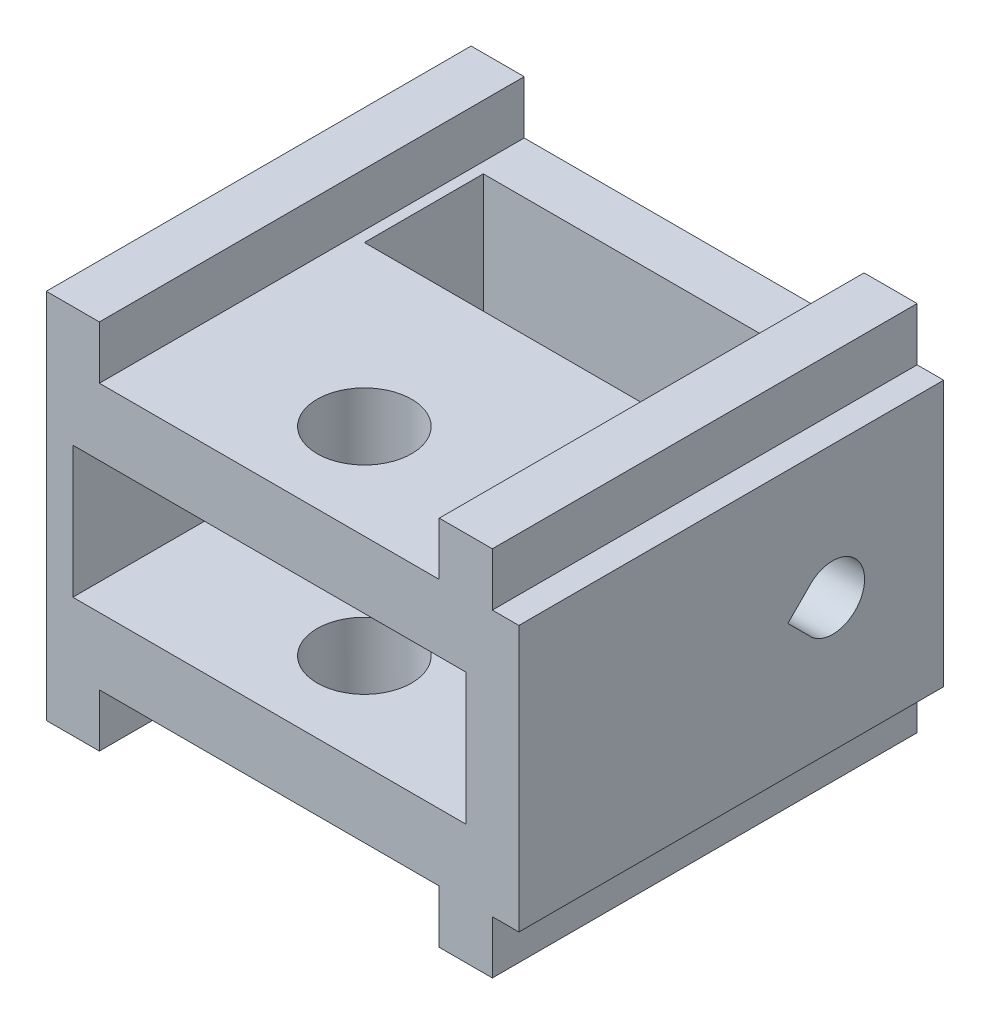
ISO-10303-21;
HEADER;
FILE_DESCRIPTION(('STEP AP214'),'2;1');
FILE_NAME('part.step','',(''),(''),'','','');
FILE_SCHEMA(('AUTOMOTIVE_DESIGN { 1 0 10303 214 1 1 1 1 }'));
ENDSEC;
DATA;
#1=APPLICATION_CONTEXT('core data for automotive mechanical design processes');
#2=APPLICATION_PROTOCOL_DEFINITION('international standard','automotive_design',2000,#1);
#3=PRODUCT_CONTEXT('',#1,'mechanical');
#4=PRODUCT('Part','Part','',(#3));
#5=PRODUCT_RELATED_PRODUCT_CATEGORY('part','',(#4));
#6=PRODUCT_DEFINITION_FORMATION('','',#4);
#7=PRODUCT_DEFINITION_CONTEXT('part definition',#1,'design');
#8=PRODUCT_DEFINITION('design','',#6,#7);
#9=PRODUCT_DEFINITION_SHAPE('','',#8);
#10=(LENGTH_UNIT() NAMED_UNIT(*) SI_UNIT(.MILLI.,.METRE.));
#11=(NAMED_UNIT(*) PLANE_ANGLE_UNIT() SI_UNIT($,.RADIAN.));
#12=(NAMED_UNIT(*) SI_UNIT($,.STERADIAN.) SOLID_ANGLE_UNIT());
#13=UNCERTAINTY_MEASURE_WITH_UNIT(LENGTH_MEASURE(1.E-05),#10,'distance_accuracy_value','');
#14=(GEOMETRIC_REPRESENTATION_CONTEXT(3) GLOBAL_UNCERTAINTY_ASSIGNED_CONTEXT((#13)) GLOBAL_UNIT_ASSIGNED_CONTEXT((#10,
#11,#12)) REPRESENTATION_CONTEXT('',''));
#15=CARTESIAN_POINT('',(0.,0.,0.));
#16=DIRECTION('',(0.,0.,1.));
#17=DIRECTION('',(1.,0.,0.));
#18=AXIS2_PLACEMENT_3D('',#15,#16,#17);
#19=CARTESIAN_POINT('',(19.5257731958763,25.,0.721649484536076));
#20=DIRECTION('',(-1.,0.,0.));
#21=DIRECTION('',(0.,0.,1.));
#22=AXIS2_PLACEMENT_3D('',#19,#20,#21);
#23=PLANE('',#22);
#24=DIRECTION('',(0.,0.,-1.));
#25=VECTOR('',#24,1.);
#26=CARTESIAN_POINT('',(19.5257731958763,0.,0.72164948453609));
#27=LINE('',#26,#25);
#28=CARTESIAN_POINT('',(19.5257731958763,0.,40.7216494845361));
#29=VERTEX_POINT('',#28);
#30=CARTESIAN_POINT('',(19.5257731958763,0.,0.721649484536076));
#31=VERTEX_POINT('',#30);
#32=EDGE_CURVE('E335',#29,#31,#27,.T.);
#33=ORIENTED_EDGE('',*,*,#32,.F.);
#34=DIRECTION('',(0.,-1.,0.));
#35=VECTOR('',#34,1.);
#36=CARTESIAN_POINT('',(19.5257731958763,25.,40.7216494845361));
#37=LINE('',#36,#35);
#38=CARTESIAN_POINT('',(19.5257731958763,-5.,40.7216494845361));
#39=VERTEX_POINT('',#38);
#40=EDGE_CURVE('E595',#29,#39,#37,.T.);
#41=ORIENTED_EDGE('',*,*,#40,.T.);
#42=DIRECTION('',(0.,0.,1.));
#43=VECTOR('',#42,1.);
#44=CARTESIAN_POINT('',(19.5257731958763,-5.,0.721649484536076));
#45=LINE('',#44,#43);
#46=CARTESIAN_POINT('',(19.5257731958763,-5.,0.721649484536076));
#47=VERTEX_POINT('',#46);
#48=EDGE_CURVE('E413',#47,#39,#45,.T.);
#49=ORIENTED_EDGE('',*,*,#48,.F.);
#50=DIRECTION('',(0.,-1.,0.));
#51=VECTOR('',#50,1.);
#52=CARTESIAN_POINT('',(19.5257731958763,25.,0.721649484536076));
#53=LINE('',#52,#51);
#54=EDGE_CURVE('E61',#31,#47,#53,.T.);
#55=ORIENTED_EDGE('',*,*,#54,.F.);
#56=EDGE_LOOP('',(#33,#41,#49,#55));
#57=FACE_BOUND('',#56,.T.);
#58=ADVANCED_FACE('F53',(#57),#23,.F.);
#59=DIRECTION('',(0.,0.,1.));
#60=VECTOR('',#59,1.);
#61=CARTESIAN_POINT('',(19.5257731958763,25.,0.72164948453609));
#62=LINE('',#61,#60);
#63=CARTESIAN_POINT('',(19.5257731958763,25.,0.721649484536076));
#64=VERTEX_POINT('',#63);
#65=CARTESIAN_POINT('',(19.5257731958763,25.,40.7216494845361));
#66=VERTEX_POINT('',#65);
#67=EDGE_CURVE('E329',#64,#66,#62,.T.);
#68=ORIENTED_EDGE('',*,*,#67,.F.);
#69=CARTESIAN_POINT('',(19.5257731958763,30.,0.72164948453607));
#70=VERTEX_POINT('',#69);
#71=EDGE_CURVE('E12',#70,#64,#53,.T.);
#72=ORIENTED_EDGE('',*,*,#71,.F.);
#73=DIRECTION('',(0.,0.,-1.));
#74=VECTOR('',#73,1.);
#75=CARTESIAN_POINT('',(19.5257731958763,30.,0.72164948453607));
#76=LINE('',#75,#74);
#77=CARTESIAN_POINT('',(19.5257731958763,30.,40.7216494845361));
#78=VERTEX_POINT('',#77);
#79=EDGE_CURVE('E463',#78,#70,#76,.T.);
#80=ORIENTED_EDGE('',*,*,#79,.F.);
#81=EDGE_CURVE('E602',#78,#66,#37,.T.);
#82=ORIENTED_EDGE('',*,*,#81,.T.);
#83=EDGE_LOOP('',(#68,#72,#80,#82));
#84=FACE_BOUND('',#83,.T.);
#85=ADVANCED_FACE('F760',(#84),#23,.F.);
#86=CARTESIAN_POINT('',(0.,0.,0.));
#87=DIRECTION('',(0.,-1.,0.));
#88=DIRECTION('',(0.,0.,-1.));
#89=AXIS2_PLACEMENT_3D('',#86,#87,#88);
#90=PLANE('',#89);
#91=DIRECTION('',(0.,0.,1.));
#92=VECTOR('',#91,1.);
#93=CARTESIAN_POINT('',(-17.4742268041237,0.,0.));
#94=LINE('',#93,#92);
#95=CARTESIAN_POINT('',(-17.4742268041237,0.,0.721649484536076));
#96=VERTEX_POINT('',#95);
#97=CARTESIAN_POINT('',(-17.4742268041237,0.,40.7216494845361));
#98=VERTEX_POINT('',#97);
#99=EDGE_CURVE('E372',#96,#98,#94,.T.);
#100=ORIENTED_EDGE('',*,*,#99,.F.);
#101=DIRECTION('',(-1.,0.,0.));
#102=VECTOR('',#101,1.);
#103=CARTESIAN_POINT('',(19.5257731958763,0.,0.721649484536076));
#104=LINE('',#103,#102);
#105=CARTESIAN_POINT('',(14.5257731958763,0.,0.721649484536062));
#106=VERTEX_POINT('',#105);
#107=EDGE_CURVE('E568',#106,#96,#104,.T.);
#108=ORIENTED_EDGE('',*,*,#107,.F.);
#109=DIRECTION('',(0.,0.,1.));
#110=VECTOR('',#109,1.);
#111=CARTESIAN_POINT('',(14.5257731958763,0.,0.721649484536062));
#112=LINE('',#111,#110);
#113=CARTESIAN_POINT('',(14.5257731958763,0.,40.7216494845361));
#114=VERTEX_POINT('',#113);
#115=EDGE_CURVE('E387',#106,#114,#112,.T.);
#116=ORIENTED_EDGE('',*,*,#115,.T.);
#117=DIRECTION('',(1.,0.,0.));
#118=VECTOR('',#117,1.);
#119=CARTESIAN_POINT('',(19.5257731958763,0.,40.7216494845361));
#120=LINE('',#119,#118);
#121=EDGE_CURVE('E592',#98,#114,#120,.T.);
#122=ORIENTED_EDGE('',*,*,#121,.F.);
#123=EDGE_LOOP('',(#100,#108,#116,#122));
#124=FACE_BOUND('',#123,.T.);
#125=DIRECTION('',(0.,0.,-1.));
#126=VECTOR('',#125,1.);
#127=CARTESIAN_POINT('',(13.5257731958763,0.,16.7716494845361));
#128=LINE('',#127,#126);
#129=CARTESIAN_POINT('',(13.5257731958763,0.,16.7716494845361));
#130=VERTEX_POINT('',#129);
#131=CARTESIAN_POINT('',(13.5257731958763,0.,5.57164948453608));
#132=VERTEX_POINT('',#131);
#133=EDGE_CURVE('E531',#130,#132,#128,.T.);
#134=ORIENTED_EDGE('',*,*,#133,.T.);
#135=DIRECTION('',(-1.,0.,0.));
#136=VECTOR('',#135,1.);
#137=CARTESIAN_POINT('',(13.5257731958763,0.,5.57164948453608));
#138=LINE('',#137,#136);
#139=CARTESIAN_POINT('',(-16.4742268041237,0.,5.57164948453608));
#140=VERTEX_POINT('',#139);
#141=EDGE_CURVE('E535',#132,#140,#138,.T.);
#142=ORIENTED_EDGE('',*,*,#141,.T.);
#143=DIRECTION('',(0.,0.,1.));
#144=VECTOR('',#143,1.);
#145=CARTESIAN_POINT('',(-16.4742268041237,0.,16.7716494845361));
#146=LINE('',#145,#144);
#147=CARTESIAN_POINT('',(-16.4742268041237,0.,16.7716494845361));
#148=VERTEX_POINT('',#147);
#149=EDGE_CURVE('E540',#140,#148,#146,.T.);
#150=ORIENTED_EDGE('',*,*,#149,.T.);
#151=DIRECTION('',(1.,0.,0.));
#152=VECTOR('',#151,1.);
#153=CARTESIAN_POINT('',(13.5257731958763,0.,16.7716494845361));
#154=LINE('',#153,#152);
#155=EDGE_CURVE('E544',#148,#130,#154,.T.);
#156=ORIENTED_EDGE('',*,*,#155,.T.);
#157=EDGE_LOOP('',(#134,#142,#150,#156));
#158=FACE_BOUND('',#157,.T.);
#159=CARTESIAN_POINT('',(-1.47422680412371,0.,31.7716494845361));
#160=DIRECTION('',(0.,1.,0.));
#161=DIRECTION('',(0.,0.,1.));
#162=AXIS2_PLACEMENT_3D('',#159,#160,#161);
#163=CIRCLE('',#162,4.45);
#164=CARTESIAN_POINT('',(-1.47422680412371,0.,36.2216494845361));
#165=VERTEX_POINT('',#164);
#166=EDGE_CURVE('E553',#165,#165,#163,.T.);
#167=ORIENTED_EDGE('',*,*,#166,.T.);
#168=EDGE_LOOP('',(#167));
#169=FACE_BOUND('',#168,.T.);
#170=ADVANCED_FACE('F710',(#124,#158,#169),#90,.T.);
#171=CARTESIAN_POINT('',(0.,25.,0.));
#172=DIRECTION('',(0.,-1.,0.));
#173=DIRECTION('',(0.,0.,-1.));
#174=AXIS2_PLACEMENT_3D('',#171,#172,#173);
#175=PLANE('',#174);
#176=DIRECTION('',(-1.,0.,0.));
#177=VECTOR('',#176,1.);
#178=CARTESIAN_POINT('',(13.5257731958763,25.,5.57164948453608));
#179=LINE('',#178,#177);
#180=CARTESIAN_POINT('',(13.5257731958763,25.,5.57164948453608));
#181=VERTEX_POINT('',#180);
#182=CARTESIAN_POINT('',(-16.4742268041237,25.,5.57164948453608));
#183=VERTEX_POINT('',#182);
#184=EDGE_CURVE('E552',#181,#183,#179,.T.);
#185=ORIENTED_EDGE('',*,*,#184,.F.);
#186=DIRECTION('',(0.,0.,-1.));
#187=VECTOR('',#186,1.);
#188=CARTESIAN_POINT('',(13.5257731958763,25.,16.7716494845361));
#189=LINE('',#188,#187);
#190=CARTESIAN_POINT('',(13.5257731958763,25.,16.7716494845361));
#191=VERTEX_POINT('',#190);
#192=EDGE_CURVE('E549',#191,#181,#189,.T.);
#193=ORIENTED_EDGE('',*,*,#192,.F.);
#194=DIRECTION('',(1.,0.,0.));
#195=VECTOR('',#194,1.);
#196=CARTESIAN_POINT('',(13.5257731958763,25.,16.7716494845361));
#197=LINE('',#196,#195);
#198=CARTESIAN_POINT('',(-16.4742268041237,25.,16.7716494845361));
#199=VERTEX_POINT('',#198);
#200=EDGE_CURVE('E536',#199,#191,#197,.T.);
#201=ORIENTED_EDGE('',*,*,#200,.F.);
#202=DIRECTION('',(0.,0.,1.));
#203=VECTOR('',#202,1.);
#204=CARTESIAN_POINT('',(-16.4742268041237,25.,16.7716494845361));
#205=LINE('',#204,#203);
#206=EDGE_CURVE('E557',#183,#199,#205,.T.);
#207=ORIENTED_EDGE('',*,*,#206,.F.);
#208=EDGE_LOOP('',(#185,#193,#201,#207));
#209=FACE_BOUND('',#208,.T.);
#210=CARTESIAN_POINT('',(-1.47422680412371,25.,31.7716494845361));
#211=DIRECTION('',(0.,1.,0.));
#212=DIRECTION('',(0.,0.,1.));
#213=AXIS2_PLACEMENT_3D('',#210,#211,#212);
#214=CIRCLE('',#213,4.45);
#215=CARTESIAN_POINT('',(-1.47422680412371,25.,36.2216494845361));
#216=VERTEX_POINT('',#215);
#217=EDGE_CURVE('E530',#216,#216,#214,.T.);
#218=ORIENTED_EDGE('',*,*,#217,.F.);
#219=EDGE_LOOP('',(#218));
#220=FACE_BOUND('',#219,.T.);
#221=DIRECTION('',(0.,0.,-1.));
#222=VECTOR('',#221,1.);
#223=CARTESIAN_POINT('',(-17.4742268041237,25.,0.721649484536075));
#224=LINE('',#223,#222);
#225=CARTESIAN_POINT('',(-17.4742268041237,25.,40.7216494845361));
#226=VERTEX_POINT('',#225);
#227=CARTESIAN_POINT('',(-17.4742268041237,25.,0.721649484536075));
#228=VERTEX_POINT('',#227);
#229=EDGE_CURVE('E425',#226,#228,#224,.T.);
#230=ORIENTED_EDGE('',*,*,#229,.F.);
#231=DIRECTION('',(1.,0.,0.));
#232=VECTOR('',#231,1.);
#233=CARTESIAN_POINT('',(19.5257731958763,25.,40.7216494845361));
#234=LINE('',#233,#232);
#235=CARTESIAN_POINT('',(14.5257731958763,25.,40.7216494845361));
#236=VERTEX_POINT('',#235);
#237=EDGE_CURVE('E591',#226,#236,#234,.T.);
#238=ORIENTED_EDGE('',*,*,#237,.T.);
#239=DIRECTION('',(0.,0.,1.));
#240=VECTOR('',#239,1.);
#241=CARTESIAN_POINT('',(14.5257731958763,25.,0.721649484536071));
#242=LINE('',#241,#240);
#243=CARTESIAN_POINT('',(14.5257731958763,25.,0.721649484536076));
#244=VERTEX_POINT('',#243);
#245=EDGE_CURVE('E440',#244,#236,#242,.T.);
#246=ORIENTED_EDGE('',*,*,#245,.F.);
#247=DIRECTION('',(-1.,0.,0.));
#248=VECTOR('',#247,1.);
#249=CARTESIAN_POINT('',(19.5257731958763,25.,0.721649484536076));
#250=LINE('',#249,#248);
#251=EDGE_CURVE('E588',#244,#228,#250,.T.);
#252=ORIENTED_EDGE('',*,*,#251,.T.);
#253=EDGE_LOOP('',(#230,#238,#246,#252));
#254=FACE_BOUND('',#253,.T.);
#255=ADVANCED_FACE('F703',(#209,#220,#254),#175,.F.);
#256=CARTESIAN_POINT('',(-1.47422680412371,0.,31.7716494845361));
#257=DIRECTION('',(0.,1.,0.));
#258=DIRECTION('',(0.,0.,1.));
#259=AXIS2_PLACEMENT_3D('',#256,#257,#258);
#260=CYLINDRICAL_SURFACE('',#259,4.45);
#261=CARTESIAN_POINT('',(-1.47422680412371,18.7,31.7716494845361));
#262=DIRECTION('',(0.,1.,0.));
#263=DIRECTION('',(0.,0.,1.));
#264=AXIS2_PLACEMENT_3D('',#261,#262,#263);
#265=CIRCLE('',#264,4.45);
#266=CARTESIAN_POINT('',(-1.47422680412371,18.7,36.2216494845361));
#267=VERTEX_POINT('',#266);
#268=EDGE_CURVE('E526',#267,#267,#265,.F.);
#269=ORIENTED_EDGE('',*,*,#268,.T.);
#270=EDGE_LOOP('',(#269));
#271=FACE_BOUND('',#270,.T.);
#272=ORIENTED_EDGE('',*,*,#217,.T.);
#273=EDGE_LOOP('',(#272));
#274=FACE_BOUND('',#273,.T.);
#275=ADVANCED_FACE('F747',(#271,#274),#260,.F.);
#276=CARTESIAN_POINT('',(13.5257731958763,0.,16.7716494845361));
#277=DIRECTION('',(0.,0.,1.));
#278=DIRECTION('',(1.,0.,0.));
#279=AXIS2_PLACEMENT_3D('',#276,#277,#278);
#280=PLANE('',#279);
#281=DIRECTION('',(0.,1.,0.));
#282=VECTOR('',#281,1.);
#283=CARTESIAN_POINT('',(13.5257731958763,0.,16.7716494845361));
#284=LINE('',#283,#282);
#285=CARTESIAN_POINT('',(13.5257731958763,18.7,16.7716494845361));
#286=VERTEX_POINT('',#285);
#287=EDGE_CURVE('E569',#286,#191,#284,.T.);
#288=ORIENTED_EDGE('',*,*,#287,.F.);
#289=DIRECTION('',(1.,0.,0.));
#290=VECTOR('',#289,1.);
#291=CARTESIAN_POINT('',(-19.9742268041237,18.7,16.7716494845361));
#292=LINE('',#291,#290);
#293=CARTESIAN_POINT('',(-16.4742268041237,18.7,16.7716494845361));
#294=VERTEX_POINT('',#293);
#295=EDGE_CURVE('E484',#294,#286,#292,.T.);
#296=ORIENTED_EDGE('',*,*,#295,.F.);
#297=DIRECTION('',(0.,1.,0.));
#298=VECTOR('',#297,1.);
#299=CARTESIAN_POINT('',(-16.4742268041237,0.,16.7716494845361));
#300=LINE('',#299,#298);
#301=EDGE_CURVE('E575',#294,#199,#300,.T.);
#302=ORIENTED_EDGE('',*,*,#301,.T.);
#303=ORIENTED_EDGE('',*,*,#200,.T.);
#304=EDGE_LOOP('',(#288,#296,#302,#303));
#305=FACE_BOUND('',#304,.T.);
#306=ADVANCED_FACE('F745',(#305),#280,.F.);
#307=CARTESIAN_POINT('',(19.5257731958763,25.,0.721649484536076));
#308=DIRECTION('',(0.,0.,1.));
#309=DIRECTION('',(1.,0.,0.));
#310=AXIS2_PLACEMENT_3D('',#307,#308,#309);
#311=PLANE('',#310);
#312=ORIENTED_EDGE('',*,*,#71,.T.);
#313=DIRECTION('',(-1.,0.,0.));
#314=VECTOR('',#313,1.);
#315=CARTESIAN_POINT('',(22.0257731958763,25.,0.72164948453609));
#316=LINE('',#315,#314);
#317=CARTESIAN_POINT('',(22.0257731958763,25.,0.72164948453609));
#318=VERTEX_POINT('',#317);
#319=EDGE_CURVE('E362',#318,#64,#316,.T.);
#320=ORIENTED_EDGE('',*,*,#319,.F.);
#321=DIRECTION('',(0.,1.,0.));
#322=VECTOR('',#321,1.);
#323=CARTESIAN_POINT('',(22.0257731958763,0.,0.72164948453609));
#324=LINE('',#323,#322);
#325=CARTESIAN_POINT('',(22.0257731958763,0.,0.72164948453609));
#326=VERTEX_POINT('',#325);
#327=EDGE_CURVE('E330',#326,#318,#324,.T.);
#328=ORIENTED_EDGE('',*,*,#327,.F.);
#329=DIRECTION('',(-1.,0.,0.));
#330=VECTOR('',#329,1.);
#331=CARTESIAN_POINT('',(22.0257731958763,0.,0.72164948453609));
#332=LINE('',#331,#330);
#333=EDGE_CURVE('E344',#326,#31,#332,.T.);
#334=ORIENTED_EDGE('',*,*,#333,.T.);
#335=ORIENTED_EDGE('',*,*,#54,.T.);
#336=DIRECTION('',(1.,0.,0.));
#337=VECTOR('',#336,1.);
#338=CARTESIAN_POINT('',(14.5257731958763,-5.,0.721649484536062));
#339=LINE('',#338,#337);
#340=CARTESIAN_POINT('',(14.5257731958763,-5.,0.721649484536062));
#341=VERTEX_POINT('',#340);
#342=EDGE_CURVE('E405',#341,#47,#339,.T.);
#343=ORIENTED_EDGE('',*,*,#342,.F.);
#344=DIRECTION('',(0.,1.,0.));
#345=VECTOR('',#344,1.);
#346=CARTESIAN_POINT('',(14.5257731958763,-5.,0.721649484536062));
#347=LINE('',#346,#345);
#348=EDGE_CURVE('E398',#341,#106,#347,.T.);
#349=ORIENTED_EDGE('',*,*,#348,.T.);
#350=ORIENTED_EDGE('',*,*,#107,.T.);
#351=DIRECTION('',(0.,1.,0.));
#352=VECTOR('',#351,1.);
#353=CARTESIAN_POINT('',(-17.4742268041237,-5.,0.721649484536076));
#354=LINE('',#353,#352);
#355=CARTESIAN_POINT('',(-17.4742268041237,-5.,0.721649484536076));
#356=VERTEX_POINT('',#355);
#357=EDGE_CURVE('E391',#356,#96,#354,.T.);
#358=ORIENTED_EDGE('',*,*,#357,.F.);
#359=DIRECTION('',(1.,0.,0.));
#360=VECTOR('',#359,1.);
#361=CARTESIAN_POINT('',(0.,-5.,0.721649484536076));
#362=LINE('',#361,#360);
#363=CARTESIAN_POINT('',(-22.4742268041237,-5.,0.721649484536076));
#364=VERTEX_POINT('',#363);
#365=EDGE_CURVE('E367',#364,#356,#362,.T.);
#366=ORIENTED_EDGE('',*,*,#365,.F.);
#367=DIRECTION('',(0.,-1.,0.));
#368=VECTOR('',#367,1.);
#369=CARTESIAN_POINT('',(-22.4742268041237,25.,0.721649484536076));
#370=LINE('',#369,#368);
#371=CARTESIAN_POINT('',(-22.4742268041237,30.,0.721649484536075));
#372=VERTEX_POINT('',#371);
#373=EDGE_CURVE('E607',#372,#364,#370,.T.);
#374=ORIENTED_EDGE('',*,*,#373,.F.);
#375=DIRECTION('',(-1.,0.,0.));
#376=VECTOR('',#375,1.);
#377=CARTESIAN_POINT('',(-17.4742268041237,30.,0.721649484536075));
#378=LINE('',#377,#376);
#379=CARTESIAN_POINT('',(-17.4742268041237,30.,0.721649484536075));
#380=VERTEX_POINT('',#379);
#381=EDGE_CURVE('E424',#380,#372,#378,.T.);
#382=ORIENTED_EDGE('',*,*,#381,.F.);
#383=DIRECTION('',(0.,-1.,0.));
#384=VECTOR('',#383,1.);
#385=CARTESIAN_POINT('',(-17.4742268041237,30.,0.721649484536075));
#386=LINE('',#385,#384);
#387=EDGE_CURVE('E444',#380,#228,#386,.T.);
#388=ORIENTED_EDGE('',*,*,#387,.T.);
#389=ORIENTED_EDGE('',*,*,#251,.F.);
#390=DIRECTION('',(0.,-1.,0.));
#391=VECTOR('',#390,1.);
#392=CARTESIAN_POINT('',(14.5257731958763,30.,0.721649484536071));
#393=LINE('',#392,#391);
#394=CARTESIAN_POINT('',(14.5257731958763,30.,0.721649484536071));
#395=VERTEX_POINT('',#394);
#396=EDGE_CURVE('E452',#395,#244,#393,.T.);
#397=ORIENTED_EDGE('',*,*,#396,.F.);
#398=DIRECTION('',(-1.,0.,0.));
#399=VECTOR('',#398,1.);
#400=CARTESIAN_POINT('',(14.5257731958763,30.,0.721649484536071));
#401=LINE('',#400,#399);
#402=EDGE_CURVE('E456',#70,#395,#401,.T.);
#403=ORIENTED_EDGE('',*,*,#402,.F.);
#404=EDGE_LOOP('',(#312,#320,#328,#334,#335,#343,#349,#350,#358,#366,#374,#382,#388,#389,#397,#403));
#405=FACE_BOUND('',#404,.T.);
#406=ADVANCED_FACE('F616',(#405),#311,.F.);
#407=CARTESIAN_POINT('',(-22.4742268041237,25.,0.721649484536076));
#408=DIRECTION('',(1.,0.,0.));
#409=DIRECTION('',(0.,0.,-1.));
#410=AXIS2_PLACEMENT_3D('',#407,#408,#409);
#411=PLANE('',#410);
#412=DIRECTION('',(0.,-0.707106781186544,-0.707106781186551));
#413=VECTOR('',#412,1.);
#414=CARTESIAN_POINT('',(-22.4742268041237,12.5,15.3973644234599));
#415=LINE('',#414,#413);
#416=CARTESIAN_POINT('',(-22.4742268041237,12.5,15.3973644234599));
#417=VERTEX_POINT('',#416);
#418=CARTESIAN_POINT('',(-22.4742268041237,10.5764394236427,13.4738038471025));
#419=VERTEX_POINT('',#418);
#420=EDGE_CURVE('E68',#417,#419,#415,.T.);
#421=ORIENTED_EDGE('',*,*,#420,.T.);
#422=CARTESIAN_POINT('',(-22.4742268041237,12.5,11.1716494845361));
#423=DIRECTION('',(1.,0.,0.));
#424=DIRECTION('',(0.,0.,-1.));
#425=AXIS2_PLACEMENT_3D('',#422,#423,#424);
#426=CIRCLE('',#425,3.);
#427=CARTESIAN_POINT('',(-22.4742268041237,14.4235605763575,13.4738038471024));
#428=VERTEX_POINT('',#427);
#429=EDGE_CURVE('E287',#419,#428,#426,.T.);
#430=ORIENTED_EDGE('',*,*,#429,.T.);
#431=DIRECTION('',(0.,-0.707106781186549,0.707106781186546));
#432=VECTOR('',#431,1.);
#433=CARTESIAN_POINT('',(-22.4742268041237,14.4235605763575,13.4738038471024));
#434=LINE('',#433,#432);
#435=EDGE_CURVE('E291',#428,#417,#434,.T.);
#436=ORIENTED_EDGE('',*,*,#435,.T.);
#437=EDGE_LOOP('',(#421,#430,#436));
#438=FACE_BOUND('',#437,.T.);
#439=ORIENTED_EDGE('',*,*,#373,.T.);
#440=DIRECTION('',(0.,0.,-1.));
#441=VECTOR('',#440,1.);
#442=CARTESIAN_POINT('',(-22.4742268041237,-5.,0.));
#443=LINE('',#442,#441);
#444=CARTESIAN_POINT('',(-22.4742268041237,-5.,40.7216494845361));
#445=VERTEX_POINT('',#444);
#446=EDGE_CURVE('E379',#445,#364,#443,.T.);
#447=ORIENTED_EDGE('',*,*,#446,.F.);
#448=DIRECTION('',(0.,-1.,0.));
#449=VECTOR('',#448,1.);
#450=CARTESIAN_POINT('',(-22.4742268041237,25.,40.7216494845361));
#451=LINE('',#450,#449);
#452=CARTESIAN_POINT('',(-22.4742268041237,30.,40.7216494845361));
#453=VERTEX_POINT('',#452);
#454=EDGE_CURVE('E605',#453,#445,#451,.T.);
#455=ORIENTED_EDGE('',*,*,#454,.F.);
#456=DIRECTION('',(0.,0.,1.));
#457=VECTOR('',#456,1.);
#458=CARTESIAN_POINT('',(-22.4742268041237,30.,0.721649484536075));
#459=LINE('',#458,#457);
#460=EDGE_CURVE('E429',#372,#453,#459,.T.);
#461=ORIENTED_EDGE('',*,*,#460,.F.);
#462=EDGE_LOOP('',(#439,#447,#455,#461));
#463=FACE_BOUND('',#462,.T.);
#464=ADVANCED_FACE('F643',(#438,#463),#411,.F.);
#465=CARTESIAN_POINT('',(19.5257731958763,25.,40.7216494845361));
#466=DIRECTION('',(0.,0.,-1.));
#467=DIRECTION('',(-1.,0.,0.));
#468=AXIS2_PLACEMENT_3D('',#465,#466,#467);
#469=PLANE('',#468);
#470=DIRECTION('',(1.,0.,0.));
#471=VECTOR('',#470,1.);
#472=CARTESIAN_POINT('',(-19.9742268041237,6.3,40.7216494845361));
#473=LINE('',#472,#471);
#474=CARTESIAN_POINT('',(-19.9742268041237,6.3,40.7216494845361));
#475=VERTEX_POINT('',#474);
#476=CARTESIAN_POINT('',(17.0257731958763,6.3,40.7216494845361));
#477=VERTEX_POINT('',#476);
#478=EDGE_CURVE('E490',#475,#477,#473,.T.);
#479=ORIENTED_EDGE('',*,*,#478,.F.);
#480=DIRECTION('',(0.,-1.,0.));
#481=VECTOR('',#480,1.);
#482=CARTESIAN_POINT('',(-19.9742268041237,18.7,40.7216494845361));
#483=LINE('',#482,#481);
#484=CARTESIAN_POINT('',(-19.9742268041237,18.7,40.7216494845361));
#485=VERTEX_POINT('',#484);
#486=EDGE_CURVE('E448',#485,#475,#483,.T.);
#487=ORIENTED_EDGE('',*,*,#486,.F.);
#488=DIRECTION('',(-1.,0.,0.));
#489=VECTOR('',#488,1.);
#490=CARTESIAN_POINT('',(-19.9742268041237,18.7,40.7216494845361));
#491=LINE('',#490,#489);
#492=CARTESIAN_POINT('',(17.0257731958763,18.7,40.7216494845361));
#493=VERTEX_POINT('',#492);
#494=EDGE_CURVE('E498',#493,#485,#491,.T.);
#495=ORIENTED_EDGE('',*,*,#494,.F.);
#496=DIRECTION('',(0.,1.,0.));
#497=VECTOR('',#496,1.);
#498=CARTESIAN_POINT('',(17.0257731958763,18.7,40.7216494845361));
#499=LINE('',#498,#497);
#500=EDGE_CURVE('E494',#477,#493,#499,.T.);
#501=ORIENTED_EDGE('',*,*,#500,.F.);
#502=EDGE_LOOP('',(#479,#487,#495,#501));
#503=FACE_BOUND('',#502,.T.);
#504=ORIENTED_EDGE('',*,*,#454,.T.);
#505=DIRECTION('',(-1.,0.,0.));
#506=VECTOR('',#505,1.);
#507=CARTESIAN_POINT('',(0.,-5.,40.7216494845361));
#508=LINE('',#507,#506);
#509=CARTESIAN_POINT('',(-17.4742268041237,-5.,40.7216494845361));
#510=VERTEX_POINT('',#509);
#511=EDGE_CURVE('E375',#510,#445,#508,.T.);
#512=ORIENTED_EDGE('',*,*,#511,.F.);
#513=DIRECTION('',(0.,1.,0.));
#514=VECTOR('',#513,1.);
#515=CARTESIAN_POINT('',(-17.4742268041237,-5.,40.7216494845361));
#516=LINE('',#515,#514);
#517=EDGE_CURVE('E383',#510,#98,#516,.T.);
#518=ORIENTED_EDGE('',*,*,#517,.T.);
#519=ORIENTED_EDGE('',*,*,#121,.T.);
#520=DIRECTION('',(0.,1.,0.));
#521=VECTOR('',#520,1.);
#522=CARTESIAN_POINT('',(14.5257731958763,-5.,40.7216494845361));
#523=LINE('',#522,#521);
#524=CARTESIAN_POINT('',(14.5257731958763,-5.,40.7216494845361));
#525=VERTEX_POINT('',#524);
#526=EDGE_CURVE('E366',#525,#114,#523,.T.);
#527=ORIENTED_EDGE('',*,*,#526,.F.);
#528=DIRECTION('',(1.,0.,0.));
#529=VECTOR('',#528,1.);
#530=CARTESIAN_POINT('',(14.5257731958763,-5.,40.7216494845361));
#531=LINE('',#530,#529);
#532=EDGE_CURVE('E409',#525,#39,#531,.T.);
#533=ORIENTED_EDGE('',*,*,#532,.T.);
#534=ORIENTED_EDGE('',*,*,#40,.F.);
#535=DIRECTION('',(-1.,0.,0.));
#536=VECTOR('',#535,1.);
#537=CARTESIAN_POINT('',(22.0257731958763,0.,40.7216494845361));
#538=LINE('',#537,#536);
#539=CARTESIAN_POINT('',(22.0257731958763,0.,40.7216494845361));
#540=VERTEX_POINT('',#539);
#541=EDGE_CURVE('E354',#540,#29,#538,.T.);
#542=ORIENTED_EDGE('',*,*,#541,.F.);
#543=DIRECTION('',(0.,-1.,0.));
#544=VECTOR('',#543,1.);
#545=CARTESIAN_POINT('',(22.0257731958763,0.,40.7216494845361));
#546=LINE('',#545,#544);
#547=CARTESIAN_POINT('',(22.0257731958763,25.,40.7216494845361));
#548=VERTEX_POINT('',#547);
#549=EDGE_CURVE('E338',#548,#540,#546,.T.);
#550=ORIENTED_EDGE('',*,*,#549,.F.);
#551=DIRECTION('',(-1.,0.,0.));
#552=VECTOR('',#551,1.);
#553=CARTESIAN_POINT('',(22.0257731958763,25.,40.7216494845361));
#554=LINE('',#553,#552);
#555=EDGE_CURVE('E358',#548,#66,#554,.T.);
#556=ORIENTED_EDGE('',*,*,#555,.T.);
#557=ORIENTED_EDGE('',*,*,#81,.F.);
#558=DIRECTION('',(1.,0.,0.));
#559=VECTOR('',#558,1.);
#560=CARTESIAN_POINT('',(14.5257731958763,30.,40.7216494845361));
#561=LINE('',#560,#559);
#562=CARTESIAN_POINT('',(14.5257731958763,30.,40.7216494845361));
#563=VERTEX_POINT('',#562);
#564=EDGE_CURVE('E467',#563,#78,#561,.T.);
#565=ORIENTED_EDGE('',*,*,#564,.F.);
#566=DIRECTION('',(0.,-1.,0.));
#567=VECTOR('',#566,1.);
#568=CARTESIAN_POINT('',(14.5257731958763,30.,40.7216494845361));
#569=LINE('',#568,#567);
#570=EDGE_CURVE('E395',#563,#236,#569,.T.);
#571=ORIENTED_EDGE('',*,*,#570,.T.);
#572=ORIENTED_EDGE('',*,*,#237,.F.);
#573=DIRECTION('',(0.,-1.,0.));
#574=VECTOR('',#573,1.);
#575=CARTESIAN_POINT('',(-17.4742268041237,30.,40.7216494845361));
#576=LINE('',#575,#574);
#577=CARTESIAN_POINT('',(-17.4742268041237,30.,40.7216494845361));
#578=VERTEX_POINT('',#577);
#579=EDGE_CURVE('E436',#578,#226,#576,.T.);
#580=ORIENTED_EDGE('',*,*,#579,.F.);
#581=DIRECTION('',(1.,0.,0.));
#582=VECTOR('',#581,1.);
#583=CARTESIAN_POINT('',(-17.4742268041237,30.,40.7216494845361));
#584=LINE('',#583,#582);
#585=EDGE_CURVE('E433',#453,#578,#584,.T.);
#586=ORIENTED_EDGE('',*,*,#585,.F.);
#587=EDGE_LOOP('',(#504,#512,#518,#519,#527,#533,#534,#542,#550,#556,#557,#565,#571,#572,#580,#586));
#588=FACE_BOUND('',#587,.T.);
#589=ADVANCED_FACE('F645',(#503,#588),#469,.F.);
#590=CARTESIAN_POINT('',(-1.47422680412371,6.3,31.7716494845361));
#591=DIRECTION('',(0.,-1.,0.));
#592=DIRECTION('',(0.,0.,-1.));
#593=AXIS2_PLACEMENT_3D('',#590,#591,#592);
#594=CIRCLE('',#593,4.45);
#595=CARTESIAN_POINT('',(-1.47422680412371,6.3,27.3216494845361));
#596=VERTEX_POINT('',#595);
#597=EDGE_CURVE('E522',#596,#596,#594,.F.);
#598=ORIENTED_EDGE('',*,*,#597,.T.);
#599=EDGE_LOOP('',(#598));
#600=FACE_BOUND('',#599,.T.);
#601=ORIENTED_EDGE('',*,*,#166,.F.);
#602=EDGE_LOOP('',(#601));
#603=FACE_BOUND('',#602,.T.);
#604=ADVANCED_FACE('F689',(#600,#603),#260,.F.);
#605=CARTESIAN_POINT('',(13.5257731958763,0.,16.7716494845361));
#606=DIRECTION('',(1.,0.,0.));
#607=DIRECTION('',(0.,0.,-1.));
#608=AXIS2_PLACEMENT_3D('',#605,#606,#607);
#609=PLANE('',#608);
#610=DIRECTION('',(0.,-0.707106781186544,-0.707106781186551));
#611=VECTOR('',#610,1.);
#612=CARTESIAN_POINT('',(13.5257731958763,6.93714253053814,9.83450695399799));
#613=LINE('',#612,#611);
#614=CARTESIAN_POINT('',(13.5257731958763,12.5,15.3973644234599));
#615=VERTEX_POINT('',#614);
#616=CARTESIAN_POINT('',(13.5257731958763,10.5764394236427,13.4738038471025));
#617=VERTEX_POINT('',#616);
#618=EDGE_CURVE('E268',#615,#617,#613,.T.);
#619=ORIENTED_EDGE('',*,*,#618,.T.);
#620=CARTESIAN_POINT('',(13.5257731958763,12.5,11.1716494845361));
#621=DIRECTION('',(1.,0.,0.));
#622=DIRECTION('',(0.,0.,-1.));
#623=AXIS2_PLACEMENT_3D('',#620,#621,#622);
#624=CIRCLE('',#623,3.);
#625=CARTESIAN_POINT('',(13.5257731958763,14.4235605763575,13.4738038471024));
#626=VERTEX_POINT('',#625);
#627=EDGE_CURVE('E325',#617,#626,#624,.T.);
#628=ORIENTED_EDGE('',*,*,#627,.T.);
#629=DIRECTION('',(0.,-0.707106781186549,0.707106781186546));
#630=VECTOR('',#629,1.);
#631=CARTESIAN_POINT('',(13.5257731958763,5.56285746946189,22.334506953998));
#632=LINE('',#631,#630);
#633=EDGE_CURVE('E312',#626,#615,#632,.T.);
#634=ORIENTED_EDGE('',*,*,#633,.T.);
#635=EDGE_LOOP('',(#619,#628,#634));
#636=FACE_BOUND('',#635,.T.);
#637=ORIENTED_EDGE('',*,*,#192,.T.);
#638=DIRECTION('',(0.,1.,0.));
#639=VECTOR('',#638,1.);
#640=CARTESIAN_POINT('',(13.5257731958763,0.,5.57164948453608));
#641=LINE('',#640,#639);
#642=EDGE_CURVE('E548',#132,#181,#641,.T.);
#643=ORIENTED_EDGE('',*,*,#642,.F.);
#644=ORIENTED_EDGE('',*,*,#133,.F.);
#645=CARTESIAN_POINT('',(13.5257731958763,6.3,16.7716494845361));
#646=VERTEX_POINT('',#645);
#647=EDGE_CURVE('E564',#130,#646,#284,.T.);
#648=ORIENTED_EDGE('',*,*,#647,.T.);
#649=DIRECTION('',(0.,-1.,0.));
#650=VECTOR('',#649,1.);
#651=CARTESIAN_POINT('',(13.5257731958763,0.,16.7716494845361));
#652=LINE('',#651,#650);
#653=EDGE_CURVE('E518',#286,#646,#652,.T.);
#654=ORIENTED_EDGE('',*,*,#653,.F.);
#655=ORIENTED_EDGE('',*,*,#287,.T.);
#656=EDGE_LOOP('',(#637,#643,#644,#648,#654,#655));
#657=FACE_BOUND('',#656,.T.);
#658=ADVANCED_FACE('F685',(#636,#657),#609,.F.);
#659=CARTESIAN_POINT('',(-16.4742268041237,6.3,16.7716494845361));
#660=VERTEX_POINT('',#659);
#661=EDGE_CURVE('E570',#148,#660,#300,.T.);
#662=ORIENTED_EDGE('',*,*,#661,.T.);
#663=DIRECTION('',(-1.,0.,0.));
#664=VECTOR('',#663,1.);
#665=CARTESIAN_POINT('',(-19.9742268041237,6.3,16.7716494845361));
#666=LINE('',#665,#664);
#667=EDGE_CURVE('E519',#646,#660,#666,.T.);
#668=ORIENTED_EDGE('',*,*,#667,.F.);
#669=ORIENTED_EDGE('',*,*,#647,.F.);
#670=ORIENTED_EDGE('',*,*,#155,.F.);
#671=EDGE_LOOP('',(#662,#668,#669,#670));
#672=FACE_BOUND('',#671,.T.);
#673=ADVANCED_FACE('F688',(#672),#280,.F.);
#674=CARTESIAN_POINT('',(-16.4742268041237,0.,16.7716494845361));
#675=DIRECTION('',(-1.,0.,0.));
#676=DIRECTION('',(0.,0.,1.));
#677=AXIS2_PLACEMENT_3D('',#674,#675,#676);
#678=PLANE('',#677);
#679=DIRECTION('',(0.,0.707106781186549,-0.707106781186546));
#680=VECTOR('',#679,1.);
#681=CARTESIAN_POINT('',(-16.4742268041237,5.56285746946189,22.334506953998));
#682=LINE('',#681,#680);
#683=CARTESIAN_POINT('',(-16.4742268041237,12.5,15.3973644234599));
#684=VERTEX_POINT('',#683);
#685=CARTESIAN_POINT('',(-16.4742268041237,14.4235605763575,13.4738038471024));
#686=VERTEX_POINT('',#685);
#687=EDGE_CURVE('E303',#684,#686,#682,.T.);
#688=ORIENTED_EDGE('',*,*,#687,.T.);
#689=CARTESIAN_POINT('',(-16.4742268041237,12.5,11.1716494845361));
#690=DIRECTION('',(-1.,0.,0.));
#691=DIRECTION('',(0.,0.,1.));
#692=AXIS2_PLACEMENT_3D('',#689,#690,#691);
#693=CIRCLE('',#692,3.);
#694=CARTESIAN_POINT('',(-16.4742268041237,10.5764394236427,13.4738038471025));
#695=VERTEX_POINT('',#694);
#696=EDGE_CURVE('E321',#686,#695,#693,.T.);
#697=ORIENTED_EDGE('',*,*,#696,.T.);
#698=DIRECTION('',(0.,0.707106781186544,0.707106781186551));
#699=VECTOR('',#698,1.);
#700=CARTESIAN_POINT('',(-16.4742268041237,6.93714253053814,9.83450695399799));
#701=LINE('',#700,#699);
#702=EDGE_CURVE('E315',#695,#684,#701,.T.);
#703=ORIENTED_EDGE('',*,*,#702,.T.);
#704=EDGE_LOOP('',(#688,#697,#703));
#705=FACE_BOUND('',#704,.T.);
#706=ORIENTED_EDGE('',*,*,#206,.T.);
#707=ORIENTED_EDGE('',*,*,#301,.F.);
#708=EDGE_CURVE('E574',#660,#294,#300,.T.);
#709=ORIENTED_EDGE('',*,*,#708,.F.);
#710=ORIENTED_EDGE('',*,*,#661,.F.);
#711=ORIENTED_EDGE('',*,*,#149,.F.);
#712=DIRECTION('',(0.,1.,0.));
#713=VECTOR('',#712,1.);
#714=CARTESIAN_POINT('',(-16.4742268041237,0.,5.57164948453608));
#715=LINE('',#714,#713);
#716=EDGE_CURVE('E576',#140,#183,#715,.T.);
#717=ORIENTED_EDGE('',*,*,#716,.T.);
#718=EDGE_LOOP('',(#706,#707,#709,#710,#711,#717));
#719=FACE_BOUND('',#718,.T.);
#720=ADVANCED_FACE('F707',(#705,#719),#678,.F.);
#721=CARTESIAN_POINT('',(13.5257731958763,0.,5.57164948453608));
#722=DIRECTION('',(0.,0.,-1.));
#723=DIRECTION('',(-1.,0.,0.));
#724=AXIS2_PLACEMENT_3D('',#721,#722,#723);
#725=PLANE('',#724);
#726=ORIENTED_EDGE('',*,*,#184,.T.);
#727=ORIENTED_EDGE('',*,*,#716,.F.);
#728=ORIENTED_EDGE('',*,*,#141,.F.);
#729=ORIENTED_EDGE('',*,*,#642,.T.);
#730=EDGE_LOOP('',(#726,#727,#728,#729));
#731=FACE_BOUND('',#730,.T.);
#732=ADVANCED_FACE('F700',(#731),#725,.F.);
#733=CARTESIAN_POINT('',(-19.9742268041237,18.7,-22.2509080943823));
#734=DIRECTION('',(0.,1.,0.));
#735=DIRECTION('',(0.,0.,1.));
#736=AXIS2_PLACEMENT_3D('',#733,#734,#735);
#737=PLANE('',#736);
#738=CARTESIAN_POINT('',(-19.9742268041237,18.7,16.7716494845361));
#739=VERTEX_POINT('',#738);
#740=EDGE_CURVE('E479',#739,#294,#292,.T.);
#741=ORIENTED_EDGE('',*,*,#740,.T.);
#742=ORIENTED_EDGE('',*,*,#295,.T.);
#743=CARTESIAN_POINT('',(17.0257731958763,18.7,16.7716494845361));
#744=VERTEX_POINT('',#743);
#745=EDGE_CURVE('E477',#286,#744,#292,.T.);
#746=ORIENTED_EDGE('',*,*,#745,.T.);
#747=DIRECTION('',(0.,0.,1.));
#748=VECTOR('',#747,1.);
#749=CARTESIAN_POINT('',(17.0257731958763,18.7,-22.2509080943823));
#750=LINE('',#749,#748);
#751=EDGE_CURVE('E505',#744,#493,#750,.T.);
#752=ORIENTED_EDGE('',*,*,#751,.T.);
#753=ORIENTED_EDGE('',*,*,#494,.T.);
#754=DIRECTION('',(0.,0.,1.));
#755=VECTOR('',#754,1.);
#756=CARTESIAN_POINT('',(-19.9742268041237,18.7,-22.2509080943823));
#757=LINE('',#756,#755);
#758=EDGE_CURVE('E478',#739,#485,#757,.T.);
#759=ORIENTED_EDGE('',*,*,#758,.F.);
#760=EDGE_LOOP('',(#741,#742,#746,#752,#753,#759));
#761=FACE_BOUND('',#760,.T.);
#762=ORIENTED_EDGE('',*,*,#268,.F.);
#763=EDGE_LOOP('',(#762));
#764=FACE_BOUND('',#763,.T.);
#765=ADVANCED_FACE('F742',(#761,#764),#737,.F.);
#766=CARTESIAN_POINT('',(-19.9742268041237,6.3,-22.2509080943823));
#767=DIRECTION('',(0.,-1.,0.));
#768=DIRECTION('',(0.,0.,-1.));
#769=AXIS2_PLACEMENT_3D('',#766,#767,#768);
#770=PLANE('',#769);
#771=CARTESIAN_POINT('',(17.0257731958763,6.3,16.7716494845361));
#772=VERTEX_POINT('',#771);
#773=EDGE_CURVE('E514',#772,#646,#666,.T.);
#774=ORIENTED_EDGE('',*,*,#773,.T.);
#775=ORIENTED_EDGE('',*,*,#667,.T.);
#776=CARTESIAN_POINT('',(-19.9742268041237,6.3,16.7716494845361));
#777=VERTEX_POINT('',#776);
#778=EDGE_CURVE('E487',#660,#777,#666,.T.);
#779=ORIENTED_EDGE('',*,*,#778,.T.);
#780=DIRECTION('',(0.,0.,1.));
#781=VECTOR('',#780,1.);
#782=CARTESIAN_POINT('',(-19.9742268041237,6.3,-22.2509080943823));
#783=LINE('',#782,#781);
#784=EDGE_CURVE('E502',#777,#475,#783,.T.);
#785=ORIENTED_EDGE('',*,*,#784,.T.);
#786=ORIENTED_EDGE('',*,*,#478,.T.);
#787=DIRECTION('',(0.,0.,1.));
#788=VECTOR('',#787,1.);
#789=CARTESIAN_POINT('',(17.0257731958763,6.3,-22.2509080943823));
#790=LINE('',#789,#788);
#791=EDGE_CURVE('E508',#772,#477,#790,.T.);
#792=ORIENTED_EDGE('',*,*,#791,.F.);
#793=EDGE_LOOP('',(#774,#775,#779,#785,#786,#792));
#794=FACE_BOUND('',#793,.T.);
#795=ORIENTED_EDGE('',*,*,#597,.F.);
#796=EDGE_LOOP('',(#795));
#797=FACE_BOUND('',#796,.T.);
#798=ADVANCED_FACE('F717',(#794,#797),#770,.F.);
#799=CARTESIAN_POINT('',(13.5257731958763,0.,16.7716494845361));
#800=DIRECTION('',(0.,0.,1.));
#801=DIRECTION('',(1.,0.,0.));
#802=AXIS2_PLACEMENT_3D('',#799,#800,#801);
#803=PLANE('',#802);
#804=ORIENTED_EDGE('',*,*,#653,.T.);
#805=ORIENTED_EDGE('',*,*,#773,.F.);
#806=DIRECTION('',(0.,-1.,0.));
#807=VECTOR('',#806,1.);
#808=CARTESIAN_POINT('',(17.0257731958763,18.7,16.7716494845361));
#809=LINE('',#808,#807);
#810=EDGE_CURVE('E474',#744,#772,#809,.T.);
#811=ORIENTED_EDGE('',*,*,#810,.F.);
#812=ORIENTED_EDGE('',*,*,#745,.F.);
#813=EDGE_LOOP('',(#804,#805,#811,#812));
#814=FACE_BOUND('',#813,.T.);
#815=ADVANCED_FACE('F739',(#814),#803,.T.);
#816=ORIENTED_EDGE('',*,*,#708,.T.);
#817=ORIENTED_EDGE('',*,*,#740,.F.);
#818=DIRECTION('',(0.,1.,0.));
#819=VECTOR('',#818,1.);
#820=CARTESIAN_POINT('',(-19.9742268041237,18.7,16.7716494845361));
#821=LINE('',#820,#819);
#822=EDGE_CURVE('E483',#777,#739,#821,.T.);
#823=ORIENTED_EDGE('',*,*,#822,.F.);
#824=ORIENTED_EDGE('',*,*,#778,.F.);
#825=EDGE_LOOP('',(#816,#817,#823,#824));
#826=FACE_BOUND('',#825,.T.);
#827=ADVANCED_FACE('F723',(#826),#803,.T.);
#828=CARTESIAN_POINT('',(-19.9742268041237,18.7,-22.2509080943823));
#829=DIRECTION('',(-1.,0.,0.));
#830=DIRECTION('',(0.,0.,1.));
#831=AXIS2_PLACEMENT_3D('',#828,#829,#830);
#832=PLANE('',#831);
#833=ORIENTED_EDGE('',*,*,#822,.T.);
#834=ORIENTED_EDGE('',*,*,#758,.T.);
#835=ORIENTED_EDGE('',*,*,#486,.T.);
#836=ORIENTED_EDGE('',*,*,#784,.F.);
#837=EDGE_LOOP('',(#833,#834,#835,#836));
#838=FACE_BOUND('',#837,.T.);
#839=ADVANCED_FACE('F728',(#838),#832,.F.);
#840=CARTESIAN_POINT('',(17.0257731958763,18.7,-22.2509080943823));
#841=DIRECTION('',(1.,0.,0.));
#842=DIRECTION('',(0.,1.,0.));
#843=AXIS2_PLACEMENT_3D('',#840,#841,#842);
#844=PLANE('',#843);
#845=ORIENTED_EDGE('',*,*,#810,.T.);
#846=ORIENTED_EDGE('',*,*,#791,.T.);
#847=ORIENTED_EDGE('',*,*,#500,.T.);
#848=ORIENTED_EDGE('',*,*,#751,.F.);
#849=EDGE_LOOP('',(#845,#846,#847,#848));
#850=FACE_BOUND('',#849,.T.);
#851=ADVANCED_FACE('F736',(#850),#844,.F.);
#852=CARTESIAN_POINT('',(14.5257731958763,30.,0.721649484536071));
#853=DIRECTION('',(1.,0.,0.));
#854=DIRECTION('',(0.,0.,-1.));
#855=AXIS2_PLACEMENT_3D('',#852,#853,#854);
#856=PLANE('',#855);
#857=ORIENTED_EDGE('',*,*,#245,.T.);
#858=ORIENTED_EDGE('',*,*,#570,.F.);
#859=DIRECTION('',(0.,0.,1.));
#860=VECTOR('',#859,1.);
#861=CARTESIAN_POINT('',(14.5257731958763,30.,0.721649484536071));
#862=LINE('',#861,#860);
#863=EDGE_CURVE('E460',#395,#563,#862,.T.);
#864=ORIENTED_EDGE('',*,*,#863,.F.);
#865=ORIENTED_EDGE('',*,*,#396,.T.);
#866=EDGE_LOOP('',(#857,#858,#864,#865));
#867=FACE_BOUND('',#866,.T.);
#868=ADVANCED_FACE('F656',(#867),#856,.F.);
#869=CARTESIAN_POINT('',(0.,30.,0.));
#870=DIRECTION('',(0.,1.,0.));
#871=DIRECTION('',(0.,0.,1.));
#872=AXIS2_PLACEMENT_3D('',#869,#870,#871);
#873=PLANE('',#872);
#874=ORIENTED_EDGE('',*,*,#863,.T.);
#875=ORIENTED_EDGE('',*,*,#564,.T.);
#876=ORIENTED_EDGE('',*,*,#79,.T.);
#877=ORIENTED_EDGE('',*,*,#402,.T.);
#878=EDGE_LOOP('',(#874,#875,#876,#877));
#879=FACE_BOUND('',#878,.T.);
#880=ADVANCED_FACE('F659',(#879),#873,.T.);
#881=CARTESIAN_POINT('',(-17.4742268041237,30.,0.721649484536075));
#882=DIRECTION('',(-1.,0.,0.));
#883=DIRECTION('',(0.,0.,1.));
#884=AXIS2_PLACEMENT_3D('',#881,#882,#883);
#885=PLANE('',#884);
#886=ORIENTED_EDGE('',*,*,#229,.T.);
#887=ORIENTED_EDGE('',*,*,#387,.F.);
#888=DIRECTION('',(0.,0.,-1.));
#889=VECTOR('',#888,1.);
#890=CARTESIAN_POINT('',(-17.4742268041237,30.,0.721649484536075));
#891=LINE('',#890,#889);
#892=EDGE_CURVE('E420',#578,#380,#891,.T.);
#893=ORIENTED_EDGE('',*,*,#892,.F.);
#894=ORIENTED_EDGE('',*,*,#579,.T.);
#895=EDGE_LOOP('',(#886,#887,#893,#894));
#896=FACE_BOUND('',#895,.T.);
#897=ADVANCED_FACE('F649',(#896),#885,.F.);
#898=CARTESIAN_POINT('',(0.,30.,0.));
#899=DIRECTION('',(0.,-1.,0.));
#900=DIRECTION('',(0.,0.,-1.));
#901=AXIS2_PLACEMENT_3D('',#898,#899,#900);
#902=PLANE('',#901);
#903=ORIENTED_EDGE('',*,*,#892,.T.);
#904=ORIENTED_EDGE('',*,*,#381,.T.);
#905=ORIENTED_EDGE('',*,*,#460,.T.);
#906=ORIENTED_EDGE('',*,*,#585,.T.);
#907=EDGE_LOOP('',(#903,#904,#905,#906));
#908=FACE_BOUND('',#907,.T.);
#909=ADVANCED_FACE('F639',(#908),#902,.F.);
#910=CARTESIAN_POINT('',(14.5257731958763,-5.,0.721649484536062));
#911=DIRECTION('',(-1.,0.,0.));
#912=DIRECTION('',(0.,0.,1.));
#913=AXIS2_PLACEMENT_3D('',#910,#911,#912);
#914=PLANE('',#913);
#915=ORIENTED_EDGE('',*,*,#115,.F.);
#916=ORIENTED_EDGE('',*,*,#348,.F.);
#917=DIRECTION('',(0.,0.,1.));
#918=VECTOR('',#917,1.);
#919=CARTESIAN_POINT('',(14.5257731958763,-5.,0.721649484536062));
#920=LINE('',#919,#918);
#921=EDGE_CURVE('E401',#341,#525,#920,.T.);
#922=ORIENTED_EDGE('',*,*,#921,.T.);
#923=ORIENTED_EDGE('',*,*,#526,.T.);
#924=EDGE_LOOP('',(#915,#916,#922,#923));
#925=FACE_BOUND('',#924,.T.);
#926=ADVANCED_FACE('F627',(#925),#914,.T.);
#927=CARTESIAN_POINT('',(0.,-5.,0.));
#928=DIRECTION('',(0.,-1.,0.));
#929=DIRECTION('',(0.,0.,-1.));
#930=AXIS2_PLACEMENT_3D('',#927,#928,#929);
#931=PLANE('',#930);
#932=ORIENTED_EDGE('',*,*,#342,.T.);
#933=ORIENTED_EDGE('',*,*,#48,.T.);
#934=ORIENTED_EDGE('',*,*,#532,.F.);
#935=ORIENTED_EDGE('',*,*,#921,.F.);
#936=EDGE_LOOP('',(#932,#933,#934,#935));
#937=FACE_BOUND('',#936,.T.);
#938=ADVANCED_FACE('F624',(#937),#931,.T.);
#939=CARTESIAN_POINT('',(-17.4742268041237,-5.,0.));
#940=DIRECTION('',(-1.,0.,0.));
#941=DIRECTION('',(0.,0.,1.));
#942=AXIS2_PLACEMENT_3D('',#939,#940,#941);
#943=PLANE('',#942);
#944=ORIENTED_EDGE('',*,*,#99,.T.);
#945=ORIENTED_EDGE('',*,*,#517,.F.);
#946=DIRECTION('',(0.,0.,1.));
#947=VECTOR('',#946,1.);
#948=CARTESIAN_POINT('',(-17.4742268041237,-5.,0.));
#949=LINE('',#948,#947);
#950=EDGE_CURVE('E371',#356,#510,#949,.T.);
#951=ORIENTED_EDGE('',*,*,#950,.F.);
#952=ORIENTED_EDGE('',*,*,#357,.T.);
#953=EDGE_LOOP('',(#944,#945,#951,#952));
#954=FACE_BOUND('',#953,.T.);
#955=ADVANCED_FACE('F633',(#954),#943,.F.);
#956=CARTESIAN_POINT('',(0.,-5.,0.));
#957=DIRECTION('',(0.,-1.,0.));
#958=DIRECTION('',(0.,0.,-1.));
#959=AXIS2_PLACEMENT_3D('',#956,#957,#958);
#960=PLANE('',#959);
#961=ORIENTED_EDGE('',*,*,#365,.T.);
#962=ORIENTED_EDGE('',*,*,#950,.T.);
#963=ORIENTED_EDGE('',*,*,#511,.T.);
#964=ORIENTED_EDGE('',*,*,#446,.T.);
#965=EDGE_LOOP('',(#961,#962,#963,#964));
#966=FACE_BOUND('',#965,.T.);
#967=ADVANCED_FACE('F637',(#966),#960,.T.);
#968=CARTESIAN_POINT('',(22.0257731958763,25.,0.72164948453609));
#969=DIRECTION('',(0.,-1.,0.));
#970=DIRECTION('',(0.,0.,-1.));
#971=AXIS2_PLACEMENT_3D('',#968,#969,#970);
#972=PLANE('',#971);
#973=ORIENTED_EDGE('',*,*,#67,.T.);
#974=ORIENTED_EDGE('',*,*,#555,.F.);
#975=DIRECTION('',(0.,0.,1.));
#976=VECTOR('',#975,1.);
#977=CARTESIAN_POINT('',(22.0257731958763,25.,0.72164948453609));
#978=LINE('',#977,#976);
#979=EDGE_CURVE('E334',#318,#548,#978,.T.);
#980=ORIENTED_EDGE('',*,*,#979,.F.);
#981=ORIENTED_EDGE('',*,*,#319,.T.);
#982=EDGE_LOOP('',(#973,#974,#980,#981));
#983=FACE_BOUND('',#982,.T.);
#984=ADVANCED_FACE('F664',(#983),#972,.F.);
#985=CARTESIAN_POINT('',(22.0257731958763,0.,0.72164948453609));
#986=DIRECTION('',(0.,1.,0.));
#987=DIRECTION('',(0.,0.,1.));
#988=AXIS2_PLACEMENT_3D('',#985,#986,#987);
#989=PLANE('',#988);
#990=ORIENTED_EDGE('',*,*,#32,.T.);
#991=ORIENTED_EDGE('',*,*,#333,.F.);
#992=DIRECTION('',(0.,0.,-1.));
#993=VECTOR('',#992,1.);
#994=CARTESIAN_POINT('',(22.0257731958763,0.,0.72164948453609));
#995=LINE('',#994,#993);
#996=EDGE_CURVE('E341',#540,#326,#995,.T.);
#997=ORIENTED_EDGE('',*,*,#996,.F.);
#998=ORIENTED_EDGE('',*,*,#541,.T.);
#999=EDGE_LOOP('',(#990,#991,#997,#998));
#1000=FACE_BOUND('',#999,.T.);
#1001=ADVANCED_FACE('F670',(#1000),#989,.F.);
#1002=CARTESIAN_POINT('',(22.0257731958763,0.,0.));
#1003=DIRECTION('',(1.,0.,0.));
#1004=DIRECTION('',(0.,0.,-1.));
#1005=AXIS2_PLACEMENT_3D('',#1002,#1003,#1004);
#1006=PLANE('',#1005);
#1007=CARTESIAN_POINT('',(22.0257731958763,12.5,11.1716494845361));
#1008=DIRECTION('',(1.,0.,0.));
#1009=DIRECTION('',(0.,0.,-1.));
#1010=AXIS2_PLACEMENT_3D('',#1007,#1008,#1009);
#1011=CIRCLE('',#1010,3.);
#1012=CARTESIAN_POINT('',(22.0257731958763,10.5764394236427,13.4738038471025));
#1013=VERTEX_POINT('',#1012);
#1014=CARTESIAN_POINT('',(22.0257731958763,14.4235605763575,13.4738038471024));
#1015=VERTEX_POINT('',#1014);
#1016=EDGE_CURVE('E282',#1013,#1015,#1011,.T.);
#1017=ORIENTED_EDGE('',*,*,#1016,.F.);
#1018=DIRECTION('',(0.,-0.707106781186544,-0.707106781186551));
#1019=VECTOR('',#1018,1.);
#1020=CARTESIAN_POINT('',(22.0257731958763,12.5,15.3973644234599));
#1021=LINE('',#1020,#1019);
#1022=CARTESIAN_POINT('',(22.0257731958763,12.5,15.3973644234599));
#1023=VERTEX_POINT('',#1022);
#1024=EDGE_CURVE('E265',#1023,#1013,#1021,.T.);
#1025=ORIENTED_EDGE('',*,*,#1024,.F.);
#1026=DIRECTION('',(0.,-0.707106781186549,0.707106781186546));
#1027=VECTOR('',#1026,1.);
#1028=CARTESIAN_POINT('',(22.0257731958763,14.4235605763575,13.4738038471024));
#1029=LINE('',#1028,#1027);
#1030=EDGE_CURVE('E276',#1015,#1023,#1029,.T.);
#1031=ORIENTED_EDGE('',*,*,#1030,.F.);
#1032=EDGE_LOOP('',(#1017,#1025,#1031));
#1033=FACE_BOUND('',#1032,.T.);
#1034=ORIENTED_EDGE('',*,*,#327,.T.);
#1035=ORIENTED_EDGE('',*,*,#979,.T.);
#1036=ORIENTED_EDGE('',*,*,#549,.T.);
#1037=ORIENTED_EDGE('',*,*,#996,.T.);
#1038=EDGE_LOOP('',(#1034,#1035,#1036,#1037));
#1039=FACE_BOUND('',#1038,.T.);
#1040=ADVANCED_FACE('F284',(#1033,#1039),#1006,.T.);
#1041=CARTESIAN_POINT('',(-22.4742268041237,14.4235605763575,13.4738038471024));
#1042=DIRECTION('',(0.,0.707106781186546,0.707106781186549));
#1043=DIRECTION('',(0.,-0.707106781186549,0.707106781186546));
#1044=AXIS2_PLACEMENT_3D('',#1041,#1042,#1043);
#1045=PLANE('',#1044);
#1046=DIRECTION('',(1.,0.,0.));
#1047=VECTOR('',#1046,1.);
#1048=CARTESIAN_POINT('',(-22.4742268041237,14.4235605763575,13.4738038471024));
#1049=LINE('',#1048,#1047);
#1050=EDGE_CURVE('E279',#626,#1015,#1049,.T.);
#1051=ORIENTED_EDGE('',*,*,#1050,.T.);
#1052=ORIENTED_EDGE('',*,*,#1030,.T.);
#1053=DIRECTION('',(1.,0.,0.));
#1054=VECTOR('',#1053,1.);
#1055=CARTESIAN_POINT('',(-22.4742268041237,12.5,15.3973644234599));
#1056=LINE('',#1055,#1054);
#1057=EDGE_CURVE('E76',#615,#1023,#1056,.T.);
#1058=ORIENTED_EDGE('',*,*,#1057,.F.);
#1059=ORIENTED_EDGE('',*,*,#633,.F.);
#1060=EDGE_LOOP('',(#1051,#1052,#1058,#1059));
#1061=FACE_BOUND('',#1060,.T.);
#1062=ADVANCED_FACE('F277',(#1061),#1045,.F.);
#1063=CARTESIAN_POINT('',(-22.4742268041237,12.5,15.3973644234599));
#1064=DIRECTION('',(0.,-0.707106781186551,0.707106781186544));
#1065=DIRECTION('',(0.,-0.707106781186544,-0.707106781186551));
#1066=AXIS2_PLACEMENT_3D('',#1063,#1064,#1065);
#1067=PLANE('',#1066);
#1068=ORIENTED_EDGE('',*,*,#1057,.T.);
#1069=ORIENTED_EDGE('',*,*,#1024,.T.);
#1070=DIRECTION('',(1.,0.,0.));
#1071=VECTOR('',#1070,1.);
#1072=CARTESIAN_POINT('',(-22.4742268041237,10.5764394236427,13.4738038471025));
#1073=LINE('',#1072,#1071);
#1074=EDGE_CURVE('E304',#617,#1013,#1073,.T.);
#1075=ORIENTED_EDGE('',*,*,#1074,.F.);
#1076=ORIENTED_EDGE('',*,*,#618,.F.);
#1077=EDGE_LOOP('',(#1068,#1069,#1075,#1076));
#1078=FACE_BOUND('',#1077,.T.);
#1079=ADVANCED_FACE('F262',(#1078),#1067,.F.);
#1080=CARTESIAN_POINT('',(-22.4742268041237,12.5,11.1716494845361));
#1081=DIRECTION('',(1.,0.,0.));
#1082=DIRECTION('',(0.,0.,-1.));
#1083=AXIS2_PLACEMENT_3D('',#1080,#1081,#1082);
#1084=CYLINDRICAL_SURFACE('',#1083,3.);
#1085=ORIENTED_EDGE('',*,*,#1074,.T.);
#1086=ORIENTED_EDGE('',*,*,#1016,.T.);
#1087=ORIENTED_EDGE('',*,*,#1050,.F.);
#1088=ORIENTED_EDGE('',*,*,#627,.F.);
#1089=EDGE_LOOP('',(#1085,#1086,#1087,#1088));
#1090=FACE_BOUND('',#1089,.T.);
#1091=ADVANCED_FACE('F683',(#1090),#1084,.F.);
#1092=EDGE_CURVE('E272',#428,#686,#1049,.T.);
#1093=ORIENTED_EDGE('',*,*,#1092,.F.);
#1094=ORIENTED_EDGE('',*,*,#429,.F.);
#1095=EDGE_CURVE('E300',#419,#695,#1073,.T.);
#1096=ORIENTED_EDGE('',*,*,#1095,.T.);
#1097=ORIENTED_EDGE('',*,*,#696,.F.);
#1098=EDGE_LOOP('',(#1093,#1094,#1096,#1097));
#1099=FACE_BOUND('',#1098,.T.);
#1100=ADVANCED_FACE('F791',(#1099),#1084,.F.);
#1101=ORIENTED_EDGE('',*,*,#1095,.F.);
#1102=ORIENTED_EDGE('',*,*,#420,.F.);
#1103=EDGE_CURVE('E271',#417,#684,#1056,.T.);
#1104=ORIENTED_EDGE('',*,*,#1103,.T.);
#1105=ORIENTED_EDGE('',*,*,#702,.F.);
#1106=EDGE_LOOP('',(#1101,#1102,#1104,#1105));
#1107=FACE_BOUND('',#1106,.T.);
#1108=ADVANCED_FACE('F788',(#1107),#1067,.F.);
#1109=ORIENTED_EDGE('',*,*,#1103,.F.);
#1110=ORIENTED_EDGE('',*,*,#435,.F.);
#1111=ORIENTED_EDGE('',*,*,#1092,.T.);
#1112=ORIENTED_EDGE('',*,*,#687,.F.);
#1113=EDGE_LOOP('',(#1109,#1110,#1111,#1112));
#1114=FACE_BOUND('',#1113,.T.);
#1115=ADVANCED_FACE('F786',(#1114),#1045,.F.);
#1116=CLOSED_SHELL('',(#58,#85,#170,#255,#275,#306,#406,#464,#589,#604,#658,#673,#720,#732,#765,
#798,#815,#827,#839,#851,#868,#880,#897,#909,#926,#938,#955,#967,#984,#1001,#1040,#1062,#1079,
#1091,#1100,#1108,#1115));
#1117=MANIFOLD_SOLID_BREP('B2',#1116);
#1118=ADVANCED_BREP_SHAPE_REPRESENTATION('',(#18,#1117),#14);
#1119=SHAPE_DEFINITION_REPRESENTATION(#9,#1118);
ENDSEC;
END-ISO-10303-21;
